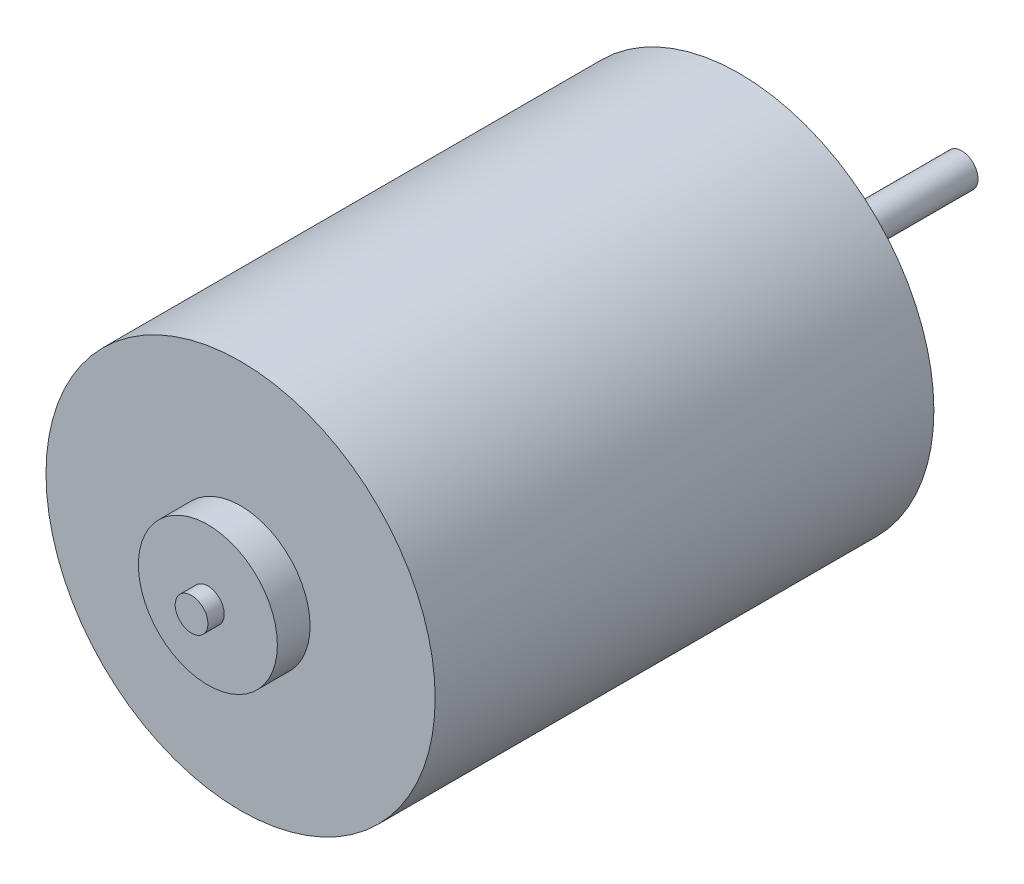
ISO-10303-21;
HEADER;
FILE_DESCRIPTION(('STEP AP214'),'2;1');
FILE_NAME('part.step','',(''),(''),'','','');
FILE_SCHEMA(('AUTOMOTIVE_DESIGN { 1 0 10303 214 1 1 1 1 }'));
ENDSEC;
DATA;
#1=APPLICATION_CONTEXT('core data for automotive mechanical design processes');
#2=APPLICATION_PROTOCOL_DEFINITION('international standard','automotive_design',2000,#1);
#3=PRODUCT_CONTEXT('',#1,'mechanical');
#4=PRODUCT('Part','Part','',(#3));
#5=PRODUCT_RELATED_PRODUCT_CATEGORY('part','',(#4));
#6=PRODUCT_DEFINITION_FORMATION('','',#4);
#7=PRODUCT_DEFINITION_CONTEXT('part definition',#1,'design');
#8=PRODUCT_DEFINITION('design','',#6,#7);
#9=PRODUCT_DEFINITION_SHAPE('','',#8);
#10=(LENGTH_UNIT() NAMED_UNIT(*) SI_UNIT(.MILLI.,.METRE.));
#11=(NAMED_UNIT(*) PLANE_ANGLE_UNIT() SI_UNIT($,.RADIAN.));
#12=(NAMED_UNIT(*) SI_UNIT($,.STERADIAN.) SOLID_ANGLE_UNIT());
#13=UNCERTAINTY_MEASURE_WITH_UNIT(LENGTH_MEASURE(1.E-05),#10,'distance_accuracy_value','');
#14=(GEOMETRIC_REPRESENTATION_CONTEXT(3) GLOBAL_UNCERTAINTY_ASSIGNED_CONTEXT((#13)) GLOBAL_UNIT_ASSIGNED_CONTEXT((#10,
#11,#12)) REPRESENTATION_CONTEXT('',''));
#15=CARTESIAN_POINT('',(0.,0.,0.));
#16=DIRECTION('',(0.,0.,1.));
#17=DIRECTION('',(1.,0.,0.));
#18=AXIS2_PLACEMENT_3D('',#15,#16,#17);
#19=CARTESIAN_POINT('',(0.,0.,30.5));
#20=DIRECTION('',(0.,0.,-1.));
#21=DIRECTION('',(-1.,0.,0.));
#22=AXIS2_PLACEMENT_3D('',#19,#20,#21);
#23=CYLINDRICAL_SURFACE('',#22,11.9);
#24=CARTESIAN_POINT('',(0.,0.,30.5));
#25=DIRECTION('',(0.,0.,1.));
#26=DIRECTION('',(1.,0.,0.));
#27=AXIS2_PLACEMENT_3D('',#24,#25,#26);
#28=CIRCLE('',#27,11.9);
#29=CARTESIAN_POINT('',(-11.9,0.,30.5));
#30=VERTEX_POINT('',#29);
#31=EDGE_CURVE('E80',#30,#30,#28,.T.);
#32=CARTESIAN_POINT('',(0.,0.,0.));
#33=DIRECTION('',(0.,0.,1.));
#34=DIRECTION('',(1.,0.,0.));
#35=AXIS2_PLACEMENT_3D('',#32,#33,#34);
#36=CIRCLE('',#35,11.9);
#37=CARTESIAN_POINT('',(-11.9,0.,0.));
#38=VERTEX_POINT('',#37);
#39=EDGE_CURVE('E46',#38,#38,#36,.T.);
#40=CARTESIAN_POINT('',(-11.9,0.,30.5));
#41=CARTESIAN_POINT('',(-11.9,0.,30.1822916666667));
#42=CARTESIAN_POINT('',(-11.9,0.,29.8645833333333));
#43=CARTESIAN_POINT('',(-11.9,0.,29.2291666666667));
#44=CARTESIAN_POINT('',(-11.9,0.,28.9114583333333));
#45=CARTESIAN_POINT('',(-11.9,0.,28.2760416666667));
#46=CARTESIAN_POINT('',(-11.9,0.,27.9583333333333));
#47=CARTESIAN_POINT('',(-11.9,0.,27.3229166666667));
#48=CARTESIAN_POINT('',(-11.9,0.,27.0052083333333));
#49=CARTESIAN_POINT('',(-11.9,0.,26.3697916666667));
#50=CARTESIAN_POINT('',(-11.9,0.,26.0520833333333));
#51=CARTESIAN_POINT('',(-11.9,0.,25.4166666666667));
#52=CARTESIAN_POINT('',(-11.9,0.,25.0989583333333));
#53=CARTESIAN_POINT('',(-11.9,0.,24.4635416666667));
#54=CARTESIAN_POINT('',(-11.9,0.,24.1458333333333));
#55=CARTESIAN_POINT('',(-11.9,0.,23.5104166666667));
#56=CARTESIAN_POINT('',(-11.9,0.,23.1927083333333));
#57=CARTESIAN_POINT('',(-11.9,0.,22.5572916666667));
#58=CARTESIAN_POINT('',(-11.9,0.,22.2395833333333));
#59=CARTESIAN_POINT('',(-11.9,0.,21.6041666666667));
#60=CARTESIAN_POINT('',(-11.9,0.,21.2864583333333));
#61=CARTESIAN_POINT('',(-11.9,0.,20.6510416666667));
#62=CARTESIAN_POINT('',(-11.9,0.,20.3333333333333));
#63=CARTESIAN_POINT('',(-11.9,0.,19.6979166666667));
#64=CARTESIAN_POINT('',(-11.9,0.,19.3802083333333));
#65=CARTESIAN_POINT('',(-11.9,0.,18.7447916666667));
#66=CARTESIAN_POINT('',(-11.9,0.,18.4270833333333));
#67=CARTESIAN_POINT('',(-11.9,0.,17.7916666666667));
#68=CARTESIAN_POINT('',(-11.9,0.,17.4739583333333));
#69=CARTESIAN_POINT('',(-11.9,0.,16.8385416666667));
#70=CARTESIAN_POINT('',(-11.9,0.,16.5208333333333));
#71=CARTESIAN_POINT('',(-11.9,0.,15.8854166666667));
#72=CARTESIAN_POINT('',(-11.9,0.,15.5677083333333));
#73=CARTESIAN_POINT('',(-11.9,0.,14.9322916666667));
#74=CARTESIAN_POINT('',(-11.9,0.,14.6145833333333));
#75=CARTESIAN_POINT('',(-11.9,0.,13.9791666666667));
#76=CARTESIAN_POINT('',(-11.9,0.,13.6614583333333));
#77=CARTESIAN_POINT('',(-11.9,0.,13.0260416666667));
#78=CARTESIAN_POINT('',(-11.9,0.,12.7083333333333));
#79=CARTESIAN_POINT('',(-11.9,0.,12.0729166666667));
#80=CARTESIAN_POINT('',(-11.9,0.,11.7552083333333));
#81=CARTESIAN_POINT('',(-11.9,0.,11.1197916666667));
#82=CARTESIAN_POINT('',(-11.9,0.,10.8020833333333));
#83=CARTESIAN_POINT('',(-11.9,0.,10.1666666666667));
#84=CARTESIAN_POINT('',(-11.9,0.,9.84895833333333));
#85=CARTESIAN_POINT('',(-11.9,0.,9.21354166666666));
#86=CARTESIAN_POINT('',(-11.9,0.,8.89583333333333));
#87=CARTESIAN_POINT('',(-11.9,0.,8.26041666666666));
#88=CARTESIAN_POINT('',(-11.9,0.,7.94270833333333));
#89=CARTESIAN_POINT('',(-11.9,0.,7.30729166666666));
#90=CARTESIAN_POINT('',(-11.9,0.,6.98958333333333));
#91=CARTESIAN_POINT('',(-11.9,0.,6.35416666666666));
#92=CARTESIAN_POINT('',(-11.9,0.,6.03645833333333));
#93=CARTESIAN_POINT('',(-11.9,0.,5.40104166666667));
#94=CARTESIAN_POINT('',(-11.9,0.,5.08333333333333));
#95=CARTESIAN_POINT('',(-11.9,0.,4.44791666666667));
#96=CARTESIAN_POINT('',(-11.9,0.,4.13020833333333));
#97=CARTESIAN_POINT('',(-11.9,0.,3.49479166666666));
#98=CARTESIAN_POINT('',(-11.9,0.,3.17708333333333));
#99=CARTESIAN_POINT('',(-11.9,0.,2.54166666666666));
#100=CARTESIAN_POINT('',(-11.9,0.,2.22395833333333));
#101=CARTESIAN_POINT('',(-11.9,0.,1.58854166666666));
#102=CARTESIAN_POINT('',(-11.9,0.,1.27083333333333));
#103=CARTESIAN_POINT('',(-11.9,0.,0.635416666666662));
#104=CARTESIAN_POINT('',(-11.9,0.,0.317708333333329));
#105=CARTESIAN_POINT('',(-11.9,0.,0.));
#106=B_SPLINE_CURVE_WITH_KNOTS('',3,(#40,#41,#42,#43,#44,#45,#46,#47,#48,#49,#50,#51,#52,#53,
#54,#55,#56,#57,#58,#59,#60,#61,#62,#63,#64,#65,#66,#67,#68,#69,#70,#71,#72,#73,#74,#75,#76,#77,
#78,#79,#80,#81,#82,#83,#84,#85,#86,#87,#88,#89,#90,#91,#92,#93,#94,#95,#96,#97,#98,#99,#100,
#101,#102,#103,#104,#105),.UNSPECIFIED.,.F.,.F.,(4,2,2,2,2,2,2,2,2,2,2,2,2,2,2,2,2,2,2,2,2,2,2,
2,2,2,2,2,2,2,2,2,4),(0.,0.953125000000003,1.90625,2.859375,3.8125,4.765625,5.71875,6.671875,
7.625,8.578125,9.53125,10.484375,11.4375,12.390625,13.34375,14.296875,15.25,16.203125,17.15625,
18.109375,19.0625,20.015625,20.96875,21.921875,22.875,23.828125,24.78125,25.734375,26.6875,
27.640625,28.59375,29.546875,30.5),.UNSPECIFIED.);
#107=EDGE_CURVE('BSEAM43',#30,#38,#106,.T.);
#108=ORIENTED_EDGE('',*,*,#31,.F.);
#109=ORIENTED_EDGE('',*,*,#39,.T.);
#110=ORIENTED_EDGE('',*,*,#107,.T.);
#111=ORIENTED_EDGE('',*,*,#107,.F.);
#112=EDGE_LOOP('',(#108,#110,#109,#111));
#113=FACE_BOUND('',#112,.T.);
#114=ADVANCED_FACE('F43',(#113),#23,.T.);
#115=CARTESIAN_POINT('',(0.,0.,30.5));
#116=DIRECTION('',(0.,0.,1.));
#117=DIRECTION('',(1.,0.,0.));
#118=AXIS2_PLACEMENT_3D('',#115,#116,#117);
#119=PLANE('',#118);
#120=CARTESIAN_POINT('',(0.,0.,30.5));
#121=DIRECTION('',(0.,0.,1.));
#122=DIRECTION('',(1.,0.,0.));
#123=AXIS2_PLACEMENT_3D('',#120,#121,#122);
#124=CIRCLE('',#123,4.25);
#125=CARTESIAN_POINT('',(4.25,0.,30.5));
#126=VERTEX_POINT('',#125);
#127=EDGE_CURVE('E74',#126,#126,#124,.T.);
#128=ORIENTED_EDGE('',*,*,#127,.F.);
#129=EDGE_LOOP('',(#128));
#130=FACE_BOUND('',#129,.T.);
#131=ORIENTED_EDGE('',*,*,#31,.T.);
#132=EDGE_LOOP('',(#131));
#133=FACE_BOUND('',#132,.T.);
#134=ADVANCED_FACE('F93',(#130,#133),#119,.T.);
#135=CARTESIAN_POINT('',(0.,0.,0.));
#136=DIRECTION('',(0.,0.,1.));
#137=DIRECTION('',(1.,0.,0.));
#138=AXIS2_PLACEMENT_3D('',#135,#136,#137);
#139=PLANE('',#138);
#140=CARTESIAN_POINT('',(0.,0.,0.));
#141=DIRECTION('',(0.,0.,-1.));
#142=DIRECTION('',(-1.,0.,0.));
#143=AXIS2_PLACEMENT_3D('',#140,#141,#142);
#144=CIRCLE('',#143,3.15);
#145=CARTESIAN_POINT('',(-3.15,0.,0.));
#146=VERTEX_POINT('',#145);
#147=EDGE_CURVE('E57',#146,#146,#144,.T.);
#148=ORIENTED_EDGE('',*,*,#147,.F.);
#149=EDGE_LOOP('',(#148));
#150=FACE_BOUND('',#149,.T.);
#151=ORIENTED_EDGE('',*,*,#39,.F.);
#152=EDGE_LOOP('',(#151));
#153=FACE_BOUND('',#152,.T.);
#154=ADVANCED_FACE('F90',(#150,#153),#139,.F.);
#155=CARTESIAN_POINT('',(0.,0.,32.5));
#156=DIRECTION('',(0.,0.,-1.));
#157=DIRECTION('',(-1.,0.,0.));
#158=AXIS2_PLACEMENT_3D('',#155,#156,#157);
#159=CYLINDRICAL_SURFACE('',#158,4.25);
#160=CARTESIAN_POINT('',(0.,0.,32.5));
#161=DIRECTION('',(0.,0.,1.));
#162=DIRECTION('',(1.,0.,0.));
#163=AXIS2_PLACEMENT_3D('',#160,#161,#162);
#164=CIRCLE('',#163,4.25);
#165=CARTESIAN_POINT('',(4.25,0.,32.5));
#166=VERTEX_POINT('',#165);
#167=EDGE_CURVE('E70',#166,#166,#164,.T.);
#168=ORIENTED_EDGE('',*,*,#167,.F.);
#169=EDGE_LOOP('',(#168));
#170=FACE_BOUND('',#169,.T.);
#171=ORIENTED_EDGE('',*,*,#127,.T.);
#172=EDGE_LOOP('',(#171));
#173=FACE_BOUND('',#172,.T.);
#174=ADVANCED_FACE('F92',(#170,#173),#159,.T.);
#175=CARTESIAN_POINT('',(0.,0.,32.5));
#176=DIRECTION('',(0.,0.,1.));
#177=DIRECTION('',(1.,0.,0.));
#178=AXIS2_PLACEMENT_3D('',#175,#176,#177);
#179=PLANE('',#178);
#180=CARTESIAN_POINT('',(0.,0.,32.5));
#181=DIRECTION('',(0.,0.,1.));
#182=DIRECTION('',(1.,0.,0.));
#183=AXIS2_PLACEMENT_3D('',#180,#181,#182);
#184=CIRCLE('',#183,1.);
#185=CARTESIAN_POINT('',(1.,0.,32.5));
#186=VERTEX_POINT('',#185);
#187=EDGE_CURVE('E10',#186,#186,#184,.T.);
#188=ORIENTED_EDGE('',*,*,#187,.F.);
#189=EDGE_LOOP('',(#188));
#190=FACE_BOUND('',#189,.T.);
#191=ORIENTED_EDGE('',*,*,#167,.T.);
#192=EDGE_LOOP('',(#191));
#193=FACE_BOUND('',#192,.T.);
#194=ADVANCED_FACE('F99',(#190,#193),#179,.T.);
#195=CARTESIAN_POINT('',(0.,0.,-1.6));
#196=DIRECTION('',(0.,0.,1.));
#197=DIRECTION('',(1.,0.,0.));
#198=AXIS2_PLACEMENT_3D('',#195,#196,#197);
#199=CYLINDRICAL_SURFACE('',#198,3.15);
#200=CARTESIAN_POINT('',(0.,0.,-1.6));
#201=DIRECTION('',(0.,0.,-1.));
#202=DIRECTION('',(-1.,0.,0.));
#203=AXIS2_PLACEMENT_3D('',#200,#201,#202);
#204=CIRCLE('',#203,3.15);
#205=CARTESIAN_POINT('',(-3.15,0.,-1.6));
#206=VERTEX_POINT('',#205);
#207=EDGE_CURVE('E65',#206,#206,#204,.T.);
#208=ORIENTED_EDGE('',*,*,#207,.F.);
#209=EDGE_LOOP('',(#208));
#210=FACE_BOUND('',#209,.T.);
#211=ORIENTED_EDGE('',*,*,#147,.T.);
#212=EDGE_LOOP('',(#211));
#213=FACE_BOUND('',#212,.T.);
#214=ADVANCED_FACE('F133',(#210,#213),#199,.T.);
#215=CARTESIAN_POINT('',(0.,0.,-1.6));
#216=DIRECTION('',(0.,0.,-1.));
#217=DIRECTION('',(-1.,0.,0.));
#218=AXIS2_PLACEMENT_3D('',#215,#216,#217);
#219=PLANE('',#218);
#220=CARTESIAN_POINT('',(0.,0.,-1.6));
#221=DIRECTION('',(0.,0.,-1.));
#222=DIRECTION('',(-1.,0.,0.));
#223=AXIS2_PLACEMENT_3D('',#220,#221,#222);
#224=CIRCLE('',#223,1.);
#225=CARTESIAN_POINT('',(-1.,0.,-1.6));
#226=VERTEX_POINT('',#225);
#227=EDGE_CURVE('E51',#226,#226,#224,.T.);
#228=ORIENTED_EDGE('',*,*,#227,.F.);
#229=EDGE_LOOP('',(#228));
#230=FACE_BOUND('',#229,.T.);
#231=ORIENTED_EDGE('',*,*,#207,.T.);
#232=EDGE_LOOP('',(#231));
#233=FACE_BOUND('',#232,.T.);
#234=ADVANCED_FACE('F144',(#230,#233),#219,.T.);
#235=CARTESIAN_POINT('',(0.,0.,-13.6));
#236=DIRECTION('',(0.,0.,1.));
#237=DIRECTION('',(1.,0.,0.));
#238=AXIS2_PLACEMENT_3D('',#235,#236,#237);
#239=CYLINDRICAL_SURFACE('',#238,1.);
#240=CARTESIAN_POINT('',(0.,0.,-13.6));
#241=DIRECTION('',(0.,0.,-1.));
#242=DIRECTION('',(-1.,0.,0.));
#243=AXIS2_PLACEMENT_3D('',#240,#241,#242);
#244=CIRCLE('',#243,1.);
#245=CARTESIAN_POINT('',(-1.,0.,-13.6));
#246=VERTEX_POINT('',#245);
#247=EDGE_CURVE('E62',#246,#246,#244,.T.);
#248=ORIENTED_EDGE('',*,*,#247,.F.);
#249=EDGE_LOOP('',(#248));
#250=FACE_BOUND('',#249,.T.);
#251=ORIENTED_EDGE('',*,*,#227,.T.);
#252=EDGE_LOOP('',(#251));
#253=FACE_BOUND('',#252,.T.);
#254=ADVANCED_FACE('F154',(#250,#253),#239,.T.);
#255=CARTESIAN_POINT('',(0.,0.,-13.6));
#256=DIRECTION('',(0.,0.,-1.));
#257=DIRECTION('',(-1.,0.,0.));
#258=AXIS2_PLACEMENT_3D('',#255,#256,#257);
#259=PLANE('',#258);
#260=ORIENTED_EDGE('',*,*,#247,.T.);
#261=EDGE_LOOP('',(#260));
#262=FACE_BOUND('',#261,.T.);
#263=ADVANCED_FACE('F164',(#262),#259,.T.);
#264=CARTESIAN_POINT('',(0.,0.,33.5));
#265=DIRECTION('',(0.,0.,-1.));
#266=DIRECTION('',(-1.,0.,0.));
#267=AXIS2_PLACEMENT_3D('',#264,#265,#266);
#268=CYLINDRICAL_SURFACE('',#267,1.);
#269=CARTESIAN_POINT('',(0.,0.,33.5));
#270=DIRECTION('',(0.,0.,1.));
#271=DIRECTION('',(1.,0.,0.));
#272=AXIS2_PLACEMENT_3D('',#269,#270,#271);
#273=CIRCLE('',#272,1.);
#274=CARTESIAN_POINT('',(1.,0.,33.5));
#275=VERTEX_POINT('',#274);
#276=EDGE_CURVE('E61',#275,#275,#273,.T.);
#277=ORIENTED_EDGE('',*,*,#276,.F.);
#278=EDGE_LOOP('',(#277));
#279=FACE_BOUND('',#278,.T.);
#280=ORIENTED_EDGE('',*,*,#187,.T.);
#281=EDGE_LOOP('',(#280));
#282=FACE_BOUND('',#281,.T.);
#283=ADVANCED_FACE('F173',(#279,#282),#268,.T.);
#284=CARTESIAN_POINT('',(0.,0.,33.5));
#285=DIRECTION('',(0.,0.,1.));
#286=DIRECTION('',(1.,0.,0.));
#287=AXIS2_PLACEMENT_3D('',#284,#285,#286);
#288=PLANE('',#287);
#289=ORIENTED_EDGE('',*,*,#276,.T.);
#290=EDGE_LOOP('',(#289));
#291=FACE_BOUND('',#290,.T.);
#292=ADVANCED_FACE('F182',(#291),#288,.T.);
#293=CLOSED_SHELL('',(#114,#134,#154,#174,#194,#214,#234,#254,#263,#283,#292));
#294=MANIFOLD_SOLID_BREP('B2',#293);
#295=ADVANCED_BREP_SHAPE_REPRESENTATION('',(#18,#294),#14);
#296=SHAPE_DEFINITION_REPRESENTATION(#9,#295);
ENDSEC;
END-ISO-10303-21;
